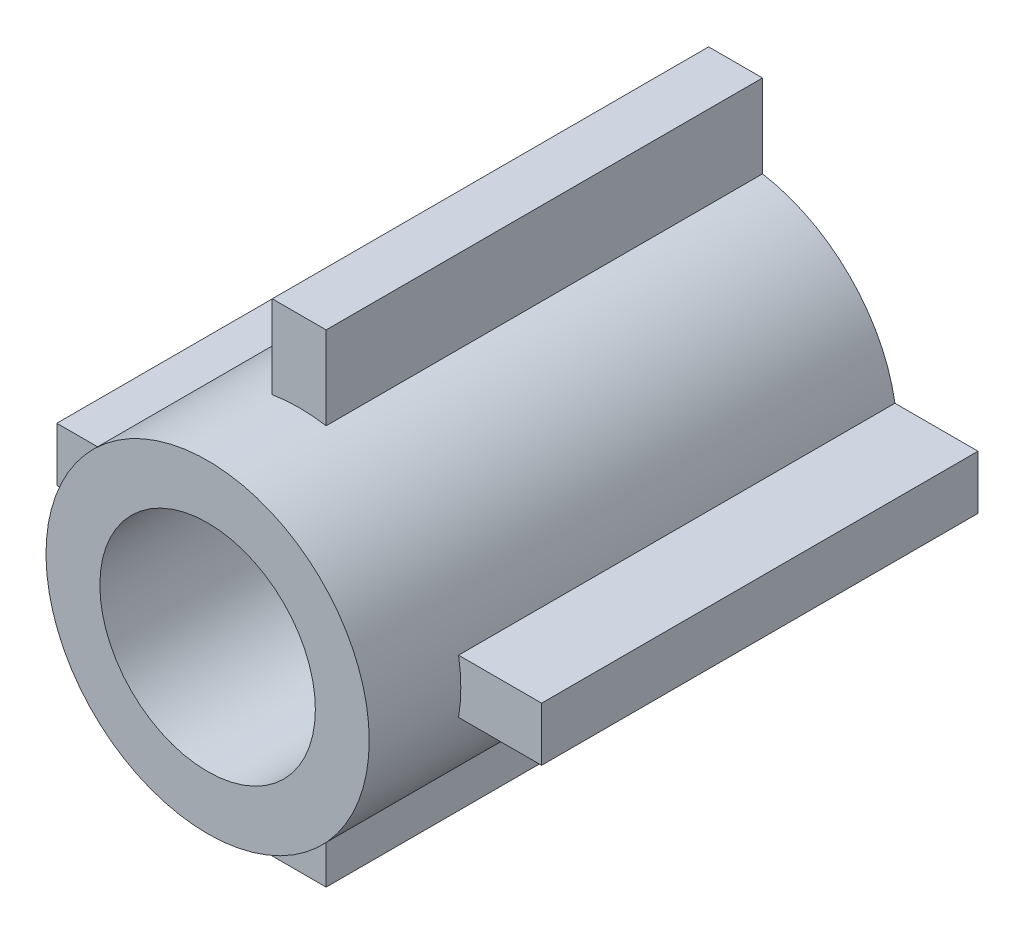
ISO-10303-21;
HEADER;
FILE_DESCRIPTION(('STEP AP214'),'2;1');
FILE_NAME('part.step','',(''),(''),'','','');
FILE_SCHEMA(('AUTOMOTIVE_DESIGN { 1 0 10303 214 1 1 1 1 }'));
ENDSEC;
DATA;
#1=APPLICATION_CONTEXT('core data for automotive mechanical design processes');
#2=APPLICATION_PROTOCOL_DEFINITION('international standard','automotive_design',2000,#1);
#3=PRODUCT_CONTEXT('',#1,'mechanical');
#4=PRODUCT('Part','Part','',(#3));
#5=PRODUCT_RELATED_PRODUCT_CATEGORY('part','',(#4));
#6=PRODUCT_DEFINITION_FORMATION('','',#4);
#7=PRODUCT_DEFINITION_CONTEXT('part definition',#1,'design');
#8=PRODUCT_DEFINITION('design','',#6,#7);
#9=PRODUCT_DEFINITION_SHAPE('','',#8);
#10=(LENGTH_UNIT() NAMED_UNIT(*) SI_UNIT(.MILLI.,.METRE.));
#11=(NAMED_UNIT(*) PLANE_ANGLE_UNIT() SI_UNIT($,.RADIAN.));
#12=(NAMED_UNIT(*) SI_UNIT($,.STERADIAN.) SOLID_ANGLE_UNIT());
#13=UNCERTAINTY_MEASURE_WITH_UNIT(LENGTH_MEASURE(1.E-05),#10,'distance_accuracy_value','');
#14=(GEOMETRIC_REPRESENTATION_CONTEXT(3) GLOBAL_UNCERTAINTY_ASSIGNED_CONTEXT((#13)) GLOBAL_UNIT_ASSIGNED_CONTEXT((#10,
#11,#12)) REPRESENTATION_CONTEXT('',''));
#15=CARTESIAN_POINT('',(0.,0.,0.));
#16=DIRECTION('',(0.,0.,1.));
#17=DIRECTION('',(1.,0.,0.));
#18=AXIS2_PLACEMENT_3D('',#15,#16,#17);
#19=CARTESIAN_POINT('',(0.,0.,8.1));
#20=DIRECTION('',(0.,0.,1.));
#21=DIRECTION('',(1.,0.,0.));
#22=AXIS2_PLACEMENT_3D('',#19,#20,#21);
#23=PLANE('',#22);
#24=CARTESIAN_POINT('',(0.,0.,8.1));
#25=DIRECTION('',(0.,0.,1.));
#26=DIRECTION('',(1.,0.,0.));
#27=AXIS2_PLACEMENT_3D('',#24,#25,#26);
#28=CIRCLE('',#27,3.);
#29=CARTESIAN_POINT('',(0.5,2.95803989154981,8.1));
#30=VERTEX_POINT('',#29);
#31=CARTESIAN_POINT('',(-0.5,2.95803989154981,8.1));
#32=VERTEX_POINT('',#31);
#33=EDGE_CURVE('E11',#30,#32,#28,.T.);
#34=ORIENTED_EDGE('',*,*,#33,.F.);
#35=DIRECTION('',(0.,-1.,0.));
#36=VECTOR('',#35,1.);
#37=CARTESIAN_POINT('',(0.5,3.,8.1));
#38=LINE('',#37,#36);
#39=CARTESIAN_POINT('',(0.5,4.5,8.1));
#40=VERTEX_POINT('',#39);
#41=EDGE_CURVE('E209',#40,#30,#38,.T.);
#42=ORIENTED_EDGE('',*,*,#41,.F.);
#43=DIRECTION('',(-1.,0.,0.));
#44=VECTOR('',#43,1.);
#45=CARTESIAN_POINT('',(0.5,4.5,8.1));
#46=LINE('',#45,#44);
#47=CARTESIAN_POINT('',(-0.5,4.5,8.1));
#48=VERTEX_POINT('',#47);
#49=EDGE_CURVE('E214',#40,#48,#46,.T.);
#50=ORIENTED_EDGE('',*,*,#49,.T.);
#51=DIRECTION('',(0.,-1.,0.));
#52=VECTOR('',#51,1.);
#53=CARTESIAN_POINT('',(-0.5,4.5,8.1));
#54=LINE('',#53,#52);
#55=EDGE_CURVE('E60',#48,#32,#54,.T.);
#56=ORIENTED_EDGE('',*,*,#55,.T.);
#57=EDGE_LOOP('',(#34,#42,#50,#56));
#58=FACE_BOUND('',#57,.T.);
#59=ADVANCED_FACE('F41',(#58),#23,.T.);
#60=CARTESIAN_POINT('',(-2.95803989154981,0.5,8.1));
#61=VERTEX_POINT('',#60);
#62=CARTESIAN_POINT('',(-2.95803989154981,-0.5,8.1));
#63=VERTEX_POINT('',#62);
#64=EDGE_CURVE('E51',#61,#63,#28,.T.);
#65=ORIENTED_EDGE('',*,*,#64,.F.);
#66=DIRECTION('',(1.,0.,0.));
#67=VECTOR('',#66,1.);
#68=CARTESIAN_POINT('',(0.,0.499999999999992,8.1));
#69=LINE('',#68,#67);
#70=CARTESIAN_POINT('',(-4.49880109774841,0.5,8.1));
#71=VERTEX_POINT('',#70);
#72=EDGE_CURVE('E285',#71,#61,#69,.T.);
#73=ORIENTED_EDGE('',*,*,#72,.F.);
#74=DIRECTION('',(0.,-1.,0.));
#75=VECTOR('',#74,1.);
#76=CARTESIAN_POINT('',(-4.49880109774841,0.,8.1));
#77=LINE('',#76,#75);
#78=CARTESIAN_POINT('',(-4.49880109774841,-0.5,8.1));
#79=VERTEX_POINT('',#78);
#80=EDGE_CURVE('E289',#71,#79,#77,.T.);
#81=ORIENTED_EDGE('',*,*,#80,.T.);
#82=DIRECTION('',(1.,0.,0.));
#83=VECTOR('',#82,1.);
#84=CARTESIAN_POINT('',(0.,-0.5,8.1));
#85=LINE('',#84,#83);
#86=EDGE_CURVE('E293',#79,#63,#85,.T.);
#87=ORIENTED_EDGE('',*,*,#86,.T.);
#88=EDGE_LOOP('',(#65,#73,#81,#87));
#89=FACE_BOUND('',#88,.T.);
#90=ADVANCED_FACE('F355',(#89),#23,.T.);
#91=CARTESIAN_POINT('',(-0.5,-2.95803989154981,8.1));
#92=VERTEX_POINT('',#91);
#93=CARTESIAN_POINT('',(0.5,-2.95803989154981,8.1));
#94=VERTEX_POINT('',#93);
#95=EDGE_CURVE('E183',#92,#94,#28,.T.);
#96=ORIENTED_EDGE('',*,*,#95,.F.);
#97=DIRECTION('',(0.,-1.,0.));
#98=VECTOR('',#97,1.);
#99=CARTESIAN_POINT('',(-0.5,0.,8.1));
#100=LINE('',#99,#98);
#101=CARTESIAN_POINT('',(-0.5,-4.45803989154981,8.1));
#102=VERTEX_POINT('',#101);
#103=EDGE_CURVE('E257',#92,#102,#100,.T.);
#104=ORIENTED_EDGE('',*,*,#103,.T.);
#105=DIRECTION('',(1.,0.,0.));
#106=VECTOR('',#105,1.);
#107=CARTESIAN_POINT('',(0.,-4.45803989154981,8.1));
#108=LINE('',#107,#106);
#109=CARTESIAN_POINT('',(0.5,-4.45803989154981,8.1));
#110=VERTEX_POINT('',#109);
#111=EDGE_CURVE('E253',#102,#110,#108,.T.);
#112=ORIENTED_EDGE('',*,*,#111,.T.);
#113=DIRECTION('',(0.,1.,0.));
#114=VECTOR('',#113,1.);
#115=CARTESIAN_POINT('',(0.5,0.,8.1));
#116=LINE('',#115,#114);
#117=EDGE_CURVE('E250',#110,#94,#116,.T.);
#118=ORIENTED_EDGE('',*,*,#117,.T.);
#119=EDGE_LOOP('',(#96,#104,#112,#118));
#120=FACE_BOUND('',#119,.T.);
#121=ADVANCED_FACE('F360',(#120),#23,.T.);
#122=CARTESIAN_POINT('',(0.,0.,8.1));
#123=DIRECTION('',(0.,0.,-1.));
#124=DIRECTION('',(-1.,0.,0.));
#125=AXIS2_PLACEMENT_3D('',#122,#123,#124);
#126=CYLINDRICAL_SURFACE('',#125,3.);
#127=DIRECTION('',(0.,0.,-1.));
#128=VECTOR('',#127,1.);
#129=CARTESIAN_POINT('',(-0.5,-2.95803989154981,8.1));
#130=LINE('',#129,#128);
#131=CARTESIAN_POINT('',(-0.5,-2.95803989154981,0.));
#132=VERTEX_POINT('',#131);
#133=EDGE_CURVE('E274',#92,#132,#130,.T.);
#134=ORIENTED_EDGE('',*,*,#133,.F.);
#135=ORIENTED_EDGE('',*,*,#95,.T.);
#136=DIRECTION('',(0.,0.,-1.));
#137=VECTOR('',#136,1.);
#138=CARTESIAN_POINT('',(0.5,-2.95803989154981,8.1));
#139=LINE('',#138,#137);
#140=CARTESIAN_POINT('',(0.5,-2.95803989154981,0.));
#141=VERTEX_POINT('',#140);
#142=EDGE_CURVE('E269',#94,#141,#139,.T.);
#143=ORIENTED_EDGE('',*,*,#142,.T.);
#144=CARTESIAN_POINT('',(0.,0.,0.));
#145=DIRECTION('',(0.,0.,1.));
#146=DIRECTION('',(1.,0.,0.));
#147=AXIS2_PLACEMENT_3D('',#144,#145,#146);
#148=CIRCLE('',#147,3.);
#149=CARTESIAN_POINT('',(2.95803989154981,-0.5,0.));
#150=VERTEX_POINT('',#149);
#151=EDGE_CURVE('E187',#141,#150,#148,.T.);
#152=ORIENTED_EDGE('',*,*,#151,.T.);
#153=DIRECTION('',(0.,0.,-1.));
#154=VECTOR('',#153,1.);
#155=CARTESIAN_POINT('',(2.95803989154981,-0.5,8.1));
#156=LINE('',#155,#154);
#157=CARTESIAN_POINT('',(2.95803989154981,-0.5,8.1));
#158=VERTEX_POINT('',#157);
#159=EDGE_CURVE('E166',#158,#150,#156,.T.);
#160=ORIENTED_EDGE('',*,*,#159,.F.);
#161=CARTESIAN_POINT('',(2.95803989154981,0.500000000000001,8.1));
#162=VERTEX_POINT('',#161);
#163=EDGE_CURVE('E53',#158,#162,#28,.T.);
#164=ORIENTED_EDGE('',*,*,#163,.T.);
#165=DIRECTION('',(0.,0.,-1.));
#166=VECTOR('',#165,1.);
#167=CARTESIAN_POINT('',(2.95803989154981,0.500000000000001,8.1));
#168=LINE('',#167,#166);
#169=CARTESIAN_POINT('',(2.95803989154981,0.500000000000001,0.));
#170=VERTEX_POINT('',#169);
#171=EDGE_CURVE('E156',#162,#170,#168,.T.);
#172=ORIENTED_EDGE('',*,*,#171,.T.);
#173=CARTESIAN_POINT('',(0.5,2.95803989154981,0.));
#174=VERTEX_POINT('',#173);
#175=EDGE_CURVE('E325',#170,#174,#148,.T.);
#176=ORIENTED_EDGE('',*,*,#175,.T.);
#177=DIRECTION('',(0.,0.,-1.));
#178=VECTOR('',#177,1.);
#179=CARTESIAN_POINT('',(0.5,2.95803989154981,8.1));
#180=LINE('',#179,#178);
#181=EDGE_CURVE('E201',#30,#174,#180,.T.);
#182=ORIENTED_EDGE('',*,*,#181,.F.);
#183=ORIENTED_EDGE('',*,*,#33,.T.);
#184=DIRECTION('',(0.,0.,-1.));
#185=VECTOR('',#184,1.);
#186=CARTESIAN_POINT('',(-0.5,2.95803989154981,8.1));
#187=LINE('',#186,#185);
#188=CARTESIAN_POINT('',(-0.5,2.95803989154981,0.));
#189=VERTEX_POINT('',#188);
#190=EDGE_CURVE('E197',#32,#189,#187,.T.);
#191=ORIENTED_EDGE('',*,*,#190,.T.);
#192=CARTESIAN_POINT('',(-2.95803989154981,0.5,0.));
#193=VERTEX_POINT('',#192);
#194=EDGE_CURVE('E188',#189,#193,#148,.T.);
#195=ORIENTED_EDGE('',*,*,#194,.T.);
#196=DIRECTION('',(0.,0.,-1.));
#197=VECTOR('',#196,1.);
#198=CARTESIAN_POINT('',(-2.95803989154981,0.5,8.1));
#199=LINE('',#198,#197);
#200=EDGE_CURVE('E316',#61,#193,#199,.T.);
#201=ORIENTED_EDGE('',*,*,#200,.F.);
#202=ORIENTED_EDGE('',*,*,#64,.T.);
#203=DIRECTION('',(0.,0.,-1.));
#204=VECTOR('',#203,1.);
#205=CARTESIAN_POINT('',(-2.95803989154981,-0.5,8.1));
#206=LINE('',#205,#204);
#207=CARTESIAN_POINT('',(-2.95803989154981,-0.5,0.));
#208=VERTEX_POINT('',#207);
#209=EDGE_CURVE('E296',#63,#208,#206,.T.);
#210=ORIENTED_EDGE('',*,*,#209,.T.);
#211=EDGE_CURVE('E45',#208,#132,#148,.T.);
#212=ORIENTED_EDGE('',*,*,#211,.T.);
#213=EDGE_LOOP('',(#134,#135,#143,#152,#160,#164,#172,#176,#182,#183,#191,#195,#201,#202,#210,#212));
#214=FACE_BOUND('',#213,.T.);
#215=CARTESIAN_POINT('',(0.,0.,9.8));
#216=DIRECTION('',(0.,0.,1.));
#217=DIRECTION('',(1.,0.,0.));
#218=AXIS2_PLACEMENT_3D('',#215,#216,#217);
#219=CIRCLE('',#218,3.);
#220=CARTESIAN_POINT('',(3.,0.,9.8));
#221=VERTEX_POINT('',#220);
#222=EDGE_CURVE('E191',#221,#221,#219,.T.);
#223=ORIENTED_EDGE('',*,*,#222,.F.);
#224=EDGE_LOOP('',(#223));
#225=FACE_BOUND('',#224,.T.);
#226=ADVANCED_FACE('F43',(#214,#225),#126,.T.);
#227=ORIENTED_EDGE('',*,*,#163,.F.);
#228=DIRECTION('',(-1.,0.,0.));
#229=VECTOR('',#228,1.);
#230=CARTESIAN_POINT('',(0.,-0.5,8.1));
#231=LINE('',#230,#229);
#232=CARTESIAN_POINT('',(4.5,-0.5,8.1));
#233=VERTEX_POINT('',#232);
#234=EDGE_CURVE('E230',#233,#158,#231,.T.);
#235=ORIENTED_EDGE('',*,*,#234,.F.);
#236=DIRECTION('',(0.,-1.,0.));
#237=VECTOR('',#236,1.);
#238=CARTESIAN_POINT('',(4.5,0.,8.1));
#239=LINE('',#238,#237);
#240=CARTESIAN_POINT('',(4.5,0.500000000000001,8.1));
#241=VERTEX_POINT('',#240);
#242=EDGE_CURVE('E174',#241,#233,#239,.T.);
#243=ORIENTED_EDGE('',*,*,#242,.F.);
#244=DIRECTION('',(-1.,0.,0.));
#245=VECTOR('',#244,1.);
#246=CARTESIAN_POINT('',(0.,0.5000000000001,8.1));
#247=LINE('',#246,#245);
#248=EDGE_CURVE('E159',#241,#162,#247,.T.);
#249=ORIENTED_EDGE('',*,*,#248,.T.);
#250=EDGE_LOOP('',(#227,#235,#243,#249));
#251=FACE_BOUND('',#250,.T.);
#252=ADVANCED_FACE('F170',(#251),#23,.T.);
#253=CARTESIAN_POINT('',(0.,0.,0.));
#254=DIRECTION('',(0.,0.,1.));
#255=DIRECTION('',(1.,0.,0.));
#256=AXIS2_PLACEMENT_3D('',#253,#254,#255);
#257=PLANE('',#256);
#258=ORIENTED_EDGE('',*,*,#194,.F.);
#259=DIRECTION('',(0.,-1.,0.));
#260=VECTOR('',#259,1.);
#261=CARTESIAN_POINT('',(-0.5,3.,0.));
#262=LINE('',#261,#260);
#263=CARTESIAN_POINT('',(-0.5,4.5,0.));
#264=VERTEX_POINT('',#263);
#265=EDGE_CURVE('E213',#264,#189,#262,.T.);
#266=ORIENTED_EDGE('',*,*,#265,.F.);
#267=DIRECTION('',(-1.,0.,0.));
#268=VECTOR('',#267,1.);
#269=CARTESIAN_POINT('',(0.5,4.5,0.));
#270=LINE('',#269,#268);
#271=CARTESIAN_POINT('',(0.5,4.5,0.));
#272=VERTEX_POINT('',#271);
#273=EDGE_CURVE('E167',#272,#264,#270,.T.);
#274=ORIENTED_EDGE('',*,*,#273,.F.);
#275=DIRECTION('',(0.,1.,0.));
#276=VECTOR('',#275,1.);
#277=CARTESIAN_POINT('',(0.5,3.,0.));
#278=LINE('',#277,#276);
#279=EDGE_CURVE('E210',#174,#272,#278,.T.);
#280=ORIENTED_EDGE('',*,*,#279,.F.);
#281=ORIENTED_EDGE('',*,*,#175,.F.);
#282=DIRECTION('',(-1.,0.,0.));
#283=VECTOR('',#282,1.);
#284=CARTESIAN_POINT('',(0.,0.5000000000001,0.));
#285=LINE('',#284,#283);
#286=CARTESIAN_POINT('',(4.5,0.500000000000001,0.));
#287=VERTEX_POINT('',#286);
#288=EDGE_CURVE('E162',#287,#170,#285,.T.);
#289=ORIENTED_EDGE('',*,*,#288,.F.);
#290=DIRECTION('',(0.,-1.,0.));
#291=VECTOR('',#290,1.);
#292=CARTESIAN_POINT('',(4.5,0.,0.));
#293=LINE('',#292,#291);
#294=CARTESIAN_POINT('',(4.5,-0.5,0.));
#295=VERTEX_POINT('',#294);
#296=EDGE_CURVE('E239',#287,#295,#293,.T.);
#297=ORIENTED_EDGE('',*,*,#296,.T.);
#298=DIRECTION('',(-1.,0.,0.));
#299=VECTOR('',#298,1.);
#300=CARTESIAN_POINT('',(0.,-0.5,0.));
#301=LINE('',#300,#299);
#302=EDGE_CURVE('E176',#295,#150,#301,.T.);
#303=ORIENTED_EDGE('',*,*,#302,.T.);
#304=ORIENTED_EDGE('',*,*,#151,.F.);
#305=DIRECTION('',(0.,1.,0.));
#306=VECTOR('',#305,1.);
#307=CARTESIAN_POINT('',(0.5,0.,0.));
#308=LINE('',#307,#306);
#309=CARTESIAN_POINT('',(0.5,-4.45803989154981,0.));
#310=VERTEX_POINT('',#309);
#311=EDGE_CURVE('E245',#310,#141,#308,.T.);
#312=ORIENTED_EDGE('',*,*,#311,.F.);
#313=DIRECTION('',(1.,0.,0.));
#314=VECTOR('',#313,1.);
#315=CARTESIAN_POINT('',(0.,-4.45803989154981,0.));
#316=LINE('',#315,#314);
#317=CARTESIAN_POINT('',(-0.5,-4.45803989154981,0.));
#318=VERTEX_POINT('',#317);
#319=EDGE_CURVE('E264',#318,#310,#316,.T.);
#320=ORIENTED_EDGE('',*,*,#319,.F.);
#321=DIRECTION('',(0.,-1.,0.));
#322=VECTOR('',#321,1.);
#323=CARTESIAN_POINT('',(-0.5,0.,0.));
#324=LINE('',#323,#322);
#325=EDGE_CURVE('E254',#132,#318,#324,.T.);
#326=ORIENTED_EDGE('',*,*,#325,.F.);
#327=ORIENTED_EDGE('',*,*,#211,.F.);
#328=DIRECTION('',(1.,0.,0.));
#329=VECTOR('',#328,1.);
#330=CARTESIAN_POINT('',(0.,-0.5,0.));
#331=LINE('',#330,#329);
#332=CARTESIAN_POINT('',(-4.49880109774841,-0.5,0.));
#333=VERTEX_POINT('',#332);
#334=EDGE_CURVE('E290',#333,#208,#331,.T.);
#335=ORIENTED_EDGE('',*,*,#334,.F.);
#336=DIRECTION('',(0.,-1.,0.));
#337=VECTOR('',#336,1.);
#338=CARTESIAN_POINT('',(-4.49880109774841,0.,0.));
#339=LINE('',#338,#337);
#340=CARTESIAN_POINT('',(-4.49880109774841,0.5,0.));
#341=VERTEX_POINT('',#340);
#342=EDGE_CURVE('E300',#341,#333,#339,.T.);
#343=ORIENTED_EDGE('',*,*,#342,.F.);
#344=DIRECTION('',(1.,0.,0.));
#345=VECTOR('',#344,1.);
#346=CARTESIAN_POINT('',(0.,0.499999999999992,0.));
#347=LINE('',#346,#345);
#348=EDGE_CURVE('E273',#341,#193,#347,.T.);
#349=ORIENTED_EDGE('',*,*,#348,.T.);
#350=EDGE_LOOP('',(#258,#266,#274,#280,#281,#289,#297,#303,#304,#312,#320,#326,#327,#335,#343,#349));
#351=FACE_BOUND('',#350,.T.);
#352=CARTESIAN_POINT('',(0.,0.,0.));
#353=DIRECTION('',(0.,0.,1.));
#354=DIRECTION('',(1.,0.,0.));
#355=AXIS2_PLACEMENT_3D('',#352,#353,#354);
#356=CIRCLE('',#355,2.);
#357=CARTESIAN_POINT('',(2.,0.,0.));
#358=VERTEX_POINT('',#357);
#359=EDGE_CURVE('E319',#358,#358,#356,.T.);
#360=ORIENTED_EDGE('',*,*,#359,.T.);
#361=EDGE_LOOP('',(#360));
#362=FACE_BOUND('',#361,.T.);
#363=ADVANCED_FACE('F336',(#351,#362),#257,.F.);
#364=CARTESIAN_POINT('',(0.,0.,8.1));
#365=DIRECTION('',(0.,0.,-1.));
#366=DIRECTION('',(-1.,0.,0.));
#367=AXIS2_PLACEMENT_3D('',#364,#365,#366);
#368=CYLINDRICAL_SURFACE('',#367,2.);
#369=ORIENTED_EDGE('',*,*,#359,.F.);
#370=EDGE_LOOP('',(#369));
#371=FACE_BOUND('',#370,.T.);
#372=CARTESIAN_POINT('',(0.,0.,9.8));
#373=DIRECTION('',(0.,0.,1.));
#374=DIRECTION('',(1.,0.,0.));
#375=AXIS2_PLACEMENT_3D('',#372,#373,#374);
#376=CIRCLE('',#375,2.);
#377=CARTESIAN_POINT('',(2.,0.,9.8));
#378=VERTEX_POINT('',#377);
#379=EDGE_CURVE('E627',#378,#378,#376,.T.);
#380=ORIENTED_EDGE('',*,*,#379,.T.);
#381=EDGE_LOOP('',(#380));
#382=FACE_BOUND('',#381,.T.);
#383=ADVANCED_FACE('F369',(#371,#382),#368,.F.);
#384=CARTESIAN_POINT('',(0.,0.499999999999992,8.1));
#385=DIRECTION('',(0.,1.,0.));
#386=DIRECTION('',(-1.,0.,0.));
#387=AXIS2_PLACEMENT_3D('',#384,#385,#386);
#388=PLANE('',#387);
#389=ORIENTED_EDGE('',*,*,#348,.F.);
#390=DIRECTION('',(0.,0.,-1.));
#391=VECTOR('',#390,1.);
#392=CARTESIAN_POINT('',(-4.49880109774841,0.5,8.1));
#393=LINE('',#392,#391);
#394=EDGE_CURVE('E313',#71,#341,#393,.T.);
#395=ORIENTED_EDGE('',*,*,#394,.F.);
#396=ORIENTED_EDGE('',*,*,#72,.T.);
#397=ORIENTED_EDGE('',*,*,#200,.T.);
#398=EDGE_LOOP('',(#389,#395,#396,#397));
#399=FACE_BOUND('',#398,.T.);
#400=ADVANCED_FACE('F402',(#399),#388,.T.);
#401=CARTESIAN_POINT('',(-4.49880109774841,0.,8.1));
#402=DIRECTION('',(1.,0.,0.));
#403=DIRECTION('',(0.,0.,-1.));
#404=AXIS2_PLACEMENT_3D('',#401,#402,#403);
#405=PLANE('',#404);
#406=ORIENTED_EDGE('',*,*,#342,.T.);
#407=DIRECTION('',(0.,0.,-1.));
#408=VECTOR('',#407,1.);
#409=CARTESIAN_POINT('',(-4.49880109774841,-0.5,8.1));
#410=LINE('',#409,#408);
#411=EDGE_CURVE('E309',#79,#333,#410,.T.);
#412=ORIENTED_EDGE('',*,*,#411,.F.);
#413=ORIENTED_EDGE('',*,*,#80,.F.);
#414=ORIENTED_EDGE('',*,*,#394,.T.);
#415=EDGE_LOOP('',(#406,#412,#413,#414));
#416=FACE_BOUND('',#415,.T.);
#417=ADVANCED_FACE('F398',(#416),#405,.F.);
#418=CARTESIAN_POINT('',(0.,-0.5,8.1));
#419=DIRECTION('',(0.,1.,0.));
#420=DIRECTION('',(0.,0.,1.));
#421=AXIS2_PLACEMENT_3D('',#418,#419,#420);
#422=PLANE('',#421);
#423=ORIENTED_EDGE('',*,*,#334,.T.);
#424=ORIENTED_EDGE('',*,*,#209,.F.);
#425=ORIENTED_EDGE('',*,*,#86,.F.);
#426=ORIENTED_EDGE('',*,*,#411,.T.);
#427=EDGE_LOOP('',(#423,#424,#425,#426));
#428=FACE_BOUND('',#427,.T.);
#429=ADVANCED_FACE('F394',(#428),#422,.F.);
#430=CARTESIAN_POINT('',(0.5,0.,8.1));
#431=DIRECTION('',(-1.,0.,0.));
#432=DIRECTION('',(0.,0.,1.));
#433=AXIS2_PLACEMENT_3D('',#430,#431,#432);
#434=PLANE('',#433);
#435=ORIENTED_EDGE('',*,*,#311,.T.);
#436=ORIENTED_EDGE('',*,*,#142,.F.);
#437=ORIENTED_EDGE('',*,*,#117,.F.);
#438=DIRECTION('',(0.,0.,-1.));
#439=VECTOR('',#438,1.);
#440=CARTESIAN_POINT('',(0.5,-4.45803989154981,8.1));
#441=LINE('',#440,#439);
#442=EDGE_CURVE('E260',#110,#310,#441,.T.);
#443=ORIENTED_EDGE('',*,*,#442,.T.);
#444=EDGE_LOOP('',(#435,#436,#437,#443));
#445=FACE_BOUND('',#444,.T.);
#446=ADVANCED_FACE('F387',(#445),#434,.F.);
#447=CARTESIAN_POINT('',(-0.5,0.,8.1));
#448=DIRECTION('',(1.,0.,0.));
#449=DIRECTION('',(0.,1.,0.));
#450=AXIS2_PLACEMENT_3D('',#447,#448,#449);
#451=PLANE('',#450);
#452=ORIENTED_EDGE('',*,*,#325,.T.);
#453=DIRECTION('',(0.,0.,-1.));
#454=VECTOR('',#453,1.);
#455=CARTESIAN_POINT('',(-0.5,-4.45803989154981,8.1));
#456=LINE('',#455,#454);
#457=EDGE_CURVE('E278',#102,#318,#456,.T.);
#458=ORIENTED_EDGE('',*,*,#457,.F.);
#459=ORIENTED_EDGE('',*,*,#103,.F.);
#460=ORIENTED_EDGE('',*,*,#133,.T.);
#461=EDGE_LOOP('',(#452,#458,#459,#460));
#462=FACE_BOUND('',#461,.T.);
#463=ADVANCED_FACE('F380',(#462),#451,.F.);
#464=CARTESIAN_POINT('',(0.,-4.45803989154981,8.1));
#465=DIRECTION('',(0.,1.,0.));
#466=DIRECTION('',(0.,0.,1.));
#467=AXIS2_PLACEMENT_3D('',#464,#465,#466);
#468=PLANE('',#467);
#469=ORIENTED_EDGE('',*,*,#319,.T.);
#470=ORIENTED_EDGE('',*,*,#442,.F.);
#471=ORIENTED_EDGE('',*,*,#111,.F.);
#472=ORIENTED_EDGE('',*,*,#457,.T.);
#473=EDGE_LOOP('',(#469,#470,#471,#472));
#474=FACE_BOUND('',#473,.T.);
#475=ADVANCED_FACE('F385',(#474),#468,.F.);
#476=CARTESIAN_POINT('',(0.,0.5000000000001,8.1));
#477=DIRECTION('',(0.,-1.,0.));
#478=DIRECTION('',(1.,0.,0.));
#479=AXIS2_PLACEMENT_3D('',#476,#477,#478);
#480=PLANE('',#479);
#481=ORIENTED_EDGE('',*,*,#288,.T.);
#482=ORIENTED_EDGE('',*,*,#171,.F.);
#483=ORIENTED_EDGE('',*,*,#248,.F.);
#484=DIRECTION('',(0.,0.,-1.));
#485=VECTOR('',#484,1.);
#486=CARTESIAN_POINT('',(4.5,0.500000000000001,8.1));
#487=LINE('',#486,#485);
#488=EDGE_CURVE('E227',#241,#287,#487,.T.);
#489=ORIENTED_EDGE('',*,*,#488,.T.);
#490=EDGE_LOOP('',(#481,#482,#483,#489));
#491=FACE_BOUND('',#490,.T.);
#492=ADVANCED_FACE('F158',(#491),#480,.F.);
#493=CARTESIAN_POINT('',(0.,-0.5,8.1));
#494=DIRECTION('',(0.,-1.,0.));
#495=DIRECTION('',(0.,0.,-1.));
#496=AXIS2_PLACEMENT_3D('',#493,#494,#495);
#497=PLANE('',#496);
#498=ORIENTED_EDGE('',*,*,#302,.F.);
#499=DIRECTION('',(0.,0.,-1.));
#500=VECTOR('',#499,1.);
#501=CARTESIAN_POINT('',(4.5,-0.5,8.1));
#502=LINE('',#501,#500);
#503=EDGE_CURVE('E231',#233,#295,#502,.T.);
#504=ORIENTED_EDGE('',*,*,#503,.F.);
#505=ORIENTED_EDGE('',*,*,#234,.T.);
#506=ORIENTED_EDGE('',*,*,#159,.T.);
#507=EDGE_LOOP('',(#498,#504,#505,#506));
#508=FACE_BOUND('',#507,.T.);
#509=ADVANCED_FACE('F335',(#508),#497,.T.);
#510=CARTESIAN_POINT('',(4.5,0.,8.1));
#511=DIRECTION('',(1.,0.,0.));
#512=DIRECTION('',(0.,0.,-1.));
#513=AXIS2_PLACEMENT_3D('',#510,#511,#512);
#514=PLANE('',#513);
#515=ORIENTED_EDGE('',*,*,#296,.F.);
#516=ORIENTED_EDGE('',*,*,#488,.F.);
#517=ORIENTED_EDGE('',*,*,#242,.T.);
#518=ORIENTED_EDGE('',*,*,#503,.T.);
#519=EDGE_LOOP('',(#515,#516,#517,#518));
#520=FACE_BOUND('',#519,.T.);
#521=ADVANCED_FACE('F339',(#520),#514,.T.);
#522=CARTESIAN_POINT('',(0.5,4.5,8.1));
#523=DIRECTION('',(0.,-1.,0.));
#524=DIRECTION('',(0.,0.,-1.));
#525=AXIS2_PLACEMENT_3D('',#522,#523,#524);
#526=PLANE('',#525);
#527=DIRECTION('',(0.,0.,-1.));
#528=VECTOR('',#527,1.);
#529=CARTESIAN_POINT('',(-0.5,4.5,8.1));
#530=LINE('',#529,#528);
#531=EDGE_CURVE('E193',#48,#264,#530,.T.);
#532=ORIENTED_EDGE('',*,*,#531,.F.);
#533=ORIENTED_EDGE('',*,*,#49,.F.);
#534=DIRECTION('',(0.,0.,-1.));
#535=VECTOR('',#534,1.);
#536=CARTESIAN_POINT('',(0.5,4.5,8.1));
#537=LINE('',#536,#535);
#538=EDGE_CURVE('E205',#40,#272,#537,.T.);
#539=ORIENTED_EDGE('',*,*,#538,.T.);
#540=ORIENTED_EDGE('',*,*,#273,.T.);
#541=EDGE_LOOP('',(#532,#533,#539,#540));
#542=FACE_BOUND('',#541,.T.);
#543=ADVANCED_FACE('F341',(#542),#526,.F.);
#544=CARTESIAN_POINT('',(-0.5,3.,8.1));
#545=DIRECTION('',(1.,0.,0.));
#546=DIRECTION('',(0.,0.,-1.));
#547=AXIS2_PLACEMENT_3D('',#544,#545,#546);
#548=PLANE('',#547);
#549=ORIENTED_EDGE('',*,*,#265,.T.);
#550=ORIENTED_EDGE('',*,*,#190,.F.);
#551=ORIENTED_EDGE('',*,*,#55,.F.);
#552=ORIENTED_EDGE('',*,*,#531,.T.);
#553=EDGE_LOOP('',(#549,#550,#551,#552));
#554=FACE_BOUND('',#553,.T.);
#555=ADVANCED_FACE('F348',(#554),#548,.F.);
#556=CARTESIAN_POINT('',(0.5,3.,8.1));
#557=DIRECTION('',(-1.,0.,0.));
#558=DIRECTION('',(0.,-1.,0.));
#559=AXIS2_PLACEMENT_3D('',#556,#557,#558);
#560=PLANE('',#559);
#561=ORIENTED_EDGE('',*,*,#279,.T.);
#562=ORIENTED_EDGE('',*,*,#538,.F.);
#563=ORIENTED_EDGE('',*,*,#41,.T.);
#564=ORIENTED_EDGE('',*,*,#181,.T.);
#565=EDGE_LOOP('',(#561,#562,#563,#564));
#566=FACE_BOUND('',#565,.T.);
#567=ADVANCED_FACE('F434',(#566),#560,.F.);
#568=CARTESIAN_POINT('',(0.,0.,9.8));
#569=DIRECTION('',(0.,0.,1.));
#570=DIRECTION('',(1.,0.,0.));
#571=AXIS2_PLACEMENT_3D('',#568,#569,#570);
#572=PLANE('',#571);
#573=ORIENTED_EDGE('',*,*,#222,.T.);
#574=EDGE_LOOP('',(#573));
#575=FACE_BOUND('',#574,.T.);
#576=ORIENTED_EDGE('',*,*,#379,.F.);
#577=EDGE_LOOP('',(#576));
#578=FACE_BOUND('',#577,.T.);
#579=ADVANCED_FACE('F442',(#575,#578),#572,.T.);
#580=CLOSED_SHELL('',(#59,#90,#121,#226,#252,#363,#383,#400,#417,#429,#446,#463,#475,#492,#509,
#521,#543,#555,#567,#579));
#581=MANIFOLD_SOLID_BREP('B2',#580);
#582=ADVANCED_BREP_SHAPE_REPRESENTATION('',(#18,#581),#14);
#583=SHAPE_DEFINITION_REPRESENTATION(#9,#582);
ENDSEC;
END-ISO-10303-21;
